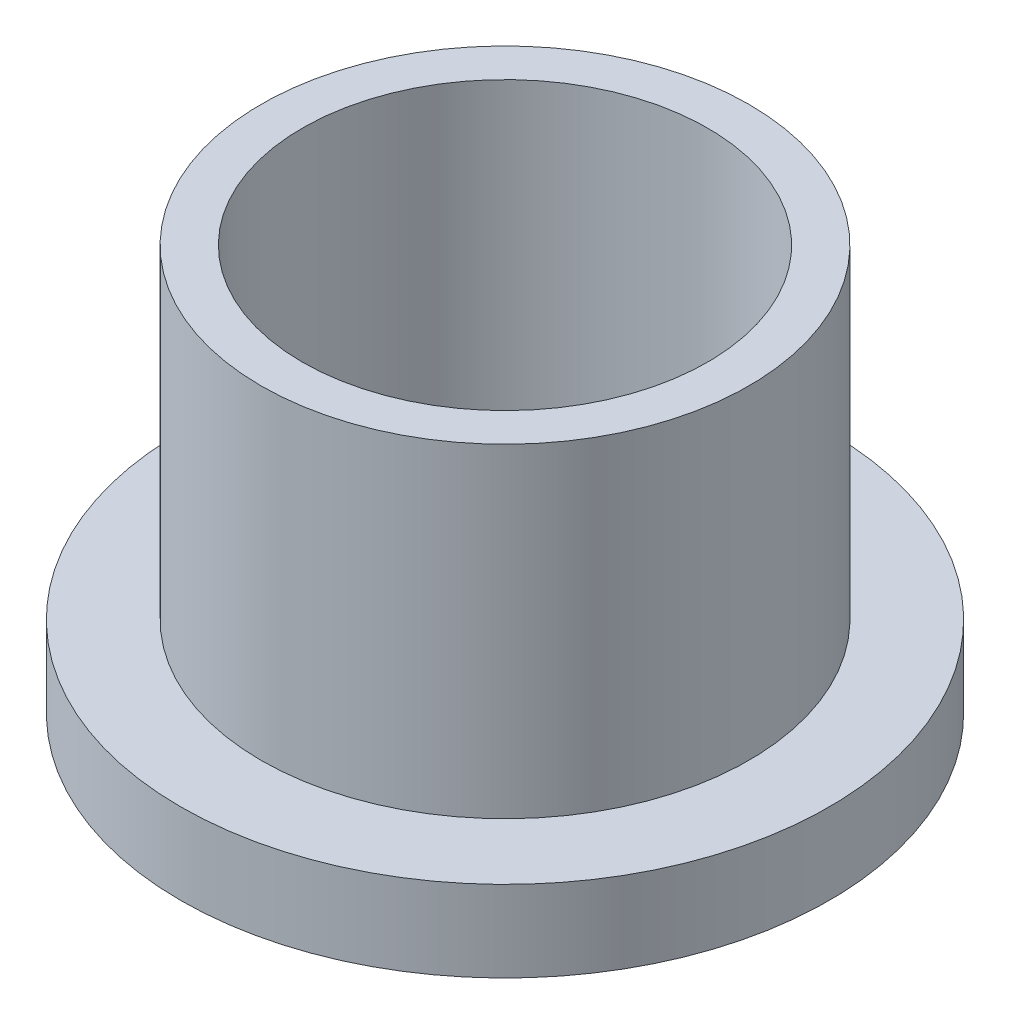
ISO-10303-21;
HEADER;
FILE_DESCRIPTION(('STEP AP214'),'2;1');
FILE_NAME('part.step','',(''),(''),'','','');
FILE_SCHEMA(('AUTOMOTIVE_DESIGN { 1 0 10303 214 1 1 1 1 }'));
ENDSEC;
DATA;
#1=APPLICATION_CONTEXT('core data for automotive mechanical design processes');
#2=APPLICATION_PROTOCOL_DEFINITION('international standard','automotive_design',2000,#1);
#3=PRODUCT_CONTEXT('',#1,'mechanical');
#4=PRODUCT('Part','Part','',(#3));
#5=PRODUCT_RELATED_PRODUCT_CATEGORY('part','',(#4));
#6=PRODUCT_DEFINITION_FORMATION('','',#4);
#7=PRODUCT_DEFINITION_CONTEXT('part definition',#1,'design');
#8=PRODUCT_DEFINITION('design','',#6,#7);
#9=PRODUCT_DEFINITION_SHAPE('','',#8);
#10=(LENGTH_UNIT() NAMED_UNIT(*) SI_UNIT(.MILLI.,.METRE.));
#11=(NAMED_UNIT(*) PLANE_ANGLE_UNIT() SI_UNIT($,.RADIAN.));
#12=(NAMED_UNIT(*) SI_UNIT($,.STERADIAN.) SOLID_ANGLE_UNIT());
#13=UNCERTAINTY_MEASURE_WITH_UNIT(LENGTH_MEASURE(1.E-05),#10,'distance_accuracy_value','');
#14=(GEOMETRIC_REPRESENTATION_CONTEXT(3) GLOBAL_UNCERTAINTY_ASSIGNED_CONTEXT((#13)) GLOBAL_UNIT_ASSIGNED_CONTEXT((#10,
#11,#12)) REPRESENTATION_CONTEXT('',''));
#15=CARTESIAN_POINT('',(0.,0.,0.));
#16=DIRECTION('',(0.,0.,1.));
#17=DIRECTION('',(1.,0.,0.));
#18=AXIS2_PLACEMENT_3D('',#15,#16,#17);
#19=CARTESIAN_POINT('',(0.,15.875,0.));
#20=DIRECTION('',(0.,1.,0.));
#21=DIRECTION('',(0.,0.,1.));
#22=AXIS2_PLACEMENT_3D('',#19,#20,#21);
#23=PLANE('',#22);
#24=CARTESIAN_POINT('',(0.,15.875,0.));
#25=DIRECTION('',(0.,1.,0.));
#26=DIRECTION('',(0.,0.,1.));
#27=AXIS2_PLACEMENT_3D('',#24,#25,#26);
#28=CIRCLE('',#27,9.5504);
#29=CARTESIAN_POINT('',(0.,15.875,9.5504));
#30=VERTEX_POINT('',#29);
#31=EDGE_CURVE('E10',#30,#30,#28,.T.);
#32=ORIENTED_EDGE('',*,*,#31,.T.);
#33=EDGE_LOOP('',(#32));
#34=FACE_BOUND('',#33,.T.);
#35=CARTESIAN_POINT('',(0.,15.875,0.));
#36=DIRECTION('',(0.,1.,0.));
#37=DIRECTION('',(0.,0.,1.));
#38=AXIS2_PLACEMENT_3D('',#35,#36,#37);
#39=CIRCLE('',#38,7.9375);
#40=CARTESIAN_POINT('',(0.,15.875,7.9375));
#41=VERTEX_POINT('',#40);
#42=EDGE_CURVE('E37',#41,#41,#39,.T.);
#43=ORIENTED_EDGE('',*,*,#42,.F.);
#44=EDGE_LOOP('',(#43));
#45=FACE_BOUND('',#44,.T.);
#46=ADVANCED_FACE('F30',(#34,#45),#23,.T.);
#47=CARTESIAN_POINT('',(0.,0.,0.));
#48=DIRECTION('',(0.,1.,0.));
#49=DIRECTION('',(0.,0.,1.));
#50=AXIS2_PLACEMENT_3D('',#47,#48,#49);
#51=PLANE('',#50);
#52=CARTESIAN_POINT('',(0.,0.,0.));
#53=DIRECTION('',(0.,1.,0.));
#54=DIRECTION('',(0.,0.,1.));
#55=AXIS2_PLACEMENT_3D('',#52,#53,#54);
#56=CIRCLE('',#55,7.9375);
#57=CARTESIAN_POINT('',(0.,0.,7.9375));
#58=VERTEX_POINT('',#57);
#59=EDGE_CURVE('E41',#58,#58,#56,.T.);
#60=ORIENTED_EDGE('',*,*,#59,.T.);
#61=EDGE_LOOP('',(#60));
#62=FACE_BOUND('',#61,.T.);
#63=CARTESIAN_POINT('',(0.,0.,0.));
#64=DIRECTION('',(0.,1.,0.));
#65=DIRECTION('',(0.,0.,1.));
#66=AXIS2_PLACEMENT_3D('',#63,#64,#65);
#67=CIRCLE('',#66,12.7);
#68=CARTESIAN_POINT('',(0.,0.,12.7));
#69=VERTEX_POINT('',#68);
#70=EDGE_CURVE('E48',#69,#69,#67,.T.);
#71=ORIENTED_EDGE('',*,*,#70,.F.);
#72=EDGE_LOOP('',(#71));
#73=FACE_BOUND('',#72,.T.);
#74=ADVANCED_FACE('F73',(#62,#73),#51,.F.);
#75=CARTESIAN_POINT('',(0.,15.875,0.));
#76=DIRECTION('',(0.,-1.,0.));
#77=DIRECTION('',(0.,0.,-1.));
#78=AXIS2_PLACEMENT_3D('',#75,#76,#77);
#79=CYLINDRICAL_SURFACE('',#78,9.5504);
#80=CARTESIAN_POINT('',(0.,3.175,0.));
#81=DIRECTION('',(0.,1.,0.));
#82=DIRECTION('',(0.,0.,1.));
#83=AXIS2_PLACEMENT_3D('',#80,#81,#82);
#84=CIRCLE('',#83,9.5504);
#85=CARTESIAN_POINT('',(0.,3.175,9.5504));
#86=VERTEX_POINT('',#85);
#87=EDGE_CURVE('E51',#86,#86,#84,.T.);
#88=ORIENTED_EDGE('',*,*,#87,.T.);
#89=EDGE_LOOP('',(#88));
#90=FACE_BOUND('',#89,.T.);
#91=ORIENTED_EDGE('',*,*,#31,.F.);
#92=EDGE_LOOP('',(#91));
#93=FACE_BOUND('',#92,.T.);
#94=ADVANCED_FACE('F32',(#90,#93),#79,.T.);
#95=CARTESIAN_POINT('',(0.,15.875,0.));
#96=DIRECTION('',(0.,-1.,0.));
#97=DIRECTION('',(0.,0.,-1.));
#98=AXIS2_PLACEMENT_3D('',#95,#96,#97);
#99=CYLINDRICAL_SURFACE('',#98,7.9375);
#100=ORIENTED_EDGE('',*,*,#42,.T.);
#101=EDGE_LOOP('',(#100));
#102=FACE_BOUND('',#101,.T.);
#103=ORIENTED_EDGE('',*,*,#59,.F.);
#104=EDGE_LOOP('',(#103));
#105=FACE_BOUND('',#104,.T.);
#106=ADVANCED_FACE('F62',(#102,#105),#99,.F.);
#107=CARTESIAN_POINT('',(0.,3.175,0.));
#108=DIRECTION('',(0.,1.,0.));
#109=DIRECTION('',(0.,0.,1.));
#110=AXIS2_PLACEMENT_3D('',#107,#108,#109);
#111=PLANE('',#110);
#112=CARTESIAN_POINT('',(0.,3.175,0.));
#113=DIRECTION('',(0.,1.,0.));
#114=DIRECTION('',(0.,0.,1.));
#115=AXIS2_PLACEMENT_3D('',#112,#113,#114);
#116=CIRCLE('',#115,12.7);
#117=CARTESIAN_POINT('',(0.,3.175,12.7));
#118=VERTEX_POINT('',#117);
#119=EDGE_CURVE('E46',#118,#118,#116,.T.);
#120=ORIENTED_EDGE('',*,*,#119,.T.);
#121=EDGE_LOOP('',(#120));
#122=FACE_BOUND('',#121,.T.);
#123=ORIENTED_EDGE('',*,*,#87,.F.);
#124=EDGE_LOOP('',(#123));
#125=FACE_BOUND('',#124,.T.);
#126=ADVANCED_FACE('F59',(#122,#125),#111,.T.);
#127=CARTESIAN_POINT('',(0.,3.175,0.));
#128=DIRECTION('',(0.,-1.,0.));
#129=DIRECTION('',(0.,0.,-1.));
#130=AXIS2_PLACEMENT_3D('',#127,#128,#129);
#131=CYLINDRICAL_SURFACE('',#130,12.7);
#132=ORIENTED_EDGE('',*,*,#119,.F.);
#133=EDGE_LOOP('',(#132));
#134=FACE_BOUND('',#133,.T.);
#135=ORIENTED_EDGE('',*,*,#70,.T.);
#136=EDGE_LOOP('',(#135));
#137=FACE_BOUND('',#136,.T.);
#138=ADVANCED_FACE('F61',(#134,#137),#131,.T.);
#139=CLOSED_SHELL('',(#46,#74,#94,#106,#126,#138));
#140=MANIFOLD_SOLID_BREP('B2',#139);
#141=ADVANCED_BREP_SHAPE_REPRESENTATION('',(#18,#140),#14);
#142=SHAPE_DEFINITION_REPRESENTATION(#9,#141);
ENDSEC;
END-ISO-10303-21;
